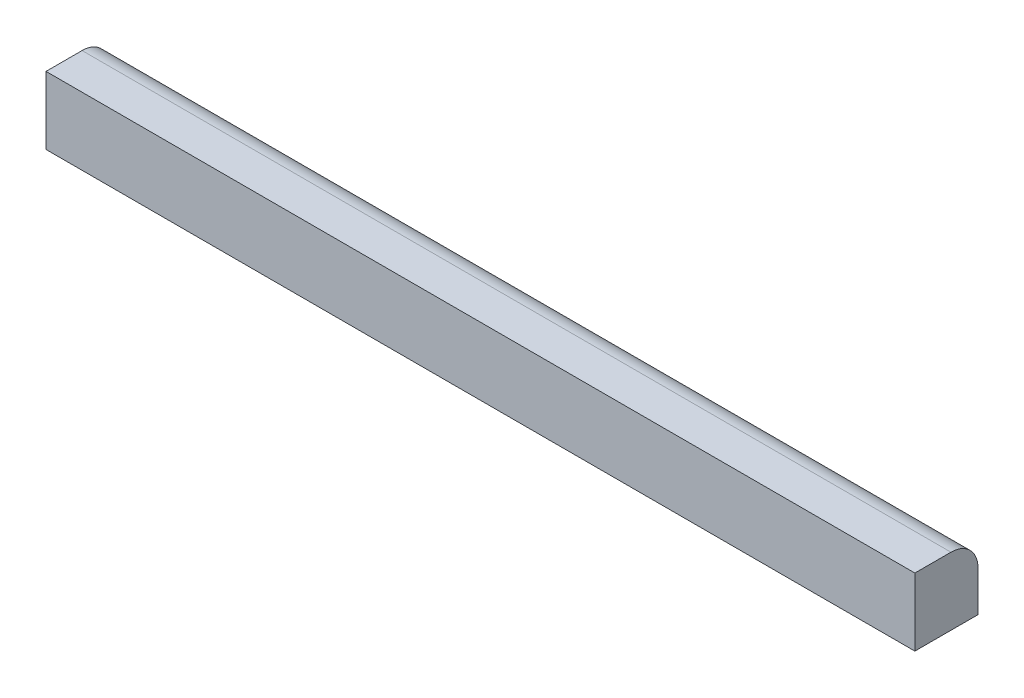
ISO-10303-21;
HEADER;
FILE_DESCRIPTION(('STEP AP214'),'2;1');
FILE_NAME('part.step','',(''),(''),'','','');
FILE_SCHEMA(('AUTOMOTIVE_DESIGN { 1 0 10303 214 1 1 1 1 }'));
ENDSEC;
DATA;
#1=APPLICATION_CONTEXT('core data for automotive mechanical design processes');
#2=APPLICATION_PROTOCOL_DEFINITION('international standard','automotive_design',2000,#1);
#3=PRODUCT_CONTEXT('',#1,'mechanical');
#4=PRODUCT('Part','Part','',(#3));
#5=PRODUCT_RELATED_PRODUCT_CATEGORY('part','',(#4));
#6=PRODUCT_DEFINITION_FORMATION('','',#4);
#7=PRODUCT_DEFINITION_CONTEXT('part definition',#1,'design');
#8=PRODUCT_DEFINITION('design','',#6,#7);
#9=PRODUCT_DEFINITION_SHAPE('','',#8);
#10=(LENGTH_UNIT() NAMED_UNIT(*) SI_UNIT(.MILLI.,.METRE.));
#11=(NAMED_UNIT(*) PLANE_ANGLE_UNIT() SI_UNIT($,.RADIAN.));
#12=(NAMED_UNIT(*) SI_UNIT($,.STERADIAN.) SOLID_ANGLE_UNIT());
#13=UNCERTAINTY_MEASURE_WITH_UNIT(LENGTH_MEASURE(1.E-05),#10,'distance_accuracy_value','');
#14=(GEOMETRIC_REPRESENTATION_CONTEXT(3) GLOBAL_UNCERTAINTY_ASSIGNED_CONTEXT((#13)) GLOBAL_UNIT_ASSIGNED_CONTEXT((#10,
#11,#12)) REPRESENTATION_CONTEXT('',''));
#15=CARTESIAN_POINT('',(0.,0.,0.));
#16=DIRECTION('',(0.,0.,1.));
#17=DIRECTION('',(1.,0.,0.));
#18=AXIS2_PLACEMENT_3D('',#15,#16,#17);
#19=CARTESIAN_POINT('',(144.5,-11.25,21.));
#20=DIRECTION('',(-1.,0.,0.));
#21=DIRECTION('',(0.,0.,1.));
#22=AXIS2_PLACEMENT_3D('',#19,#20,#21);
#23=PLANE('',#22);
#24=DIRECTION('',(0.,1.,0.));
#25=VECTOR('',#24,1.);
#26=CARTESIAN_POINT('',(144.5,-11.25,0.));
#27=LINE('',#26,#25);
#28=CARTESIAN_POINT('',(144.5,-11.25,0.));
#29=VERTEX_POINT('',#28);
#30=CARTESIAN_POINT('',(144.5,2.25,0.));
#31=VERTEX_POINT('',#30);
#32=EDGE_CURVE('E118',#29,#31,#27,.T.);
#33=ORIENTED_EDGE('',*,*,#32,.T.);
#34=CARTESIAN_POINT('',(144.5,2.25,9.));
#35=DIRECTION('',(-1.,0.,0.));
#36=DIRECTION('',(0.,0.,1.));
#37=AXIS2_PLACEMENT_3D('',#34,#35,#36);
#38=CIRCLE('',#37,9.);
#39=CARTESIAN_POINT('',(144.5,11.25,9.));
#40=VERTEX_POINT('',#39);
#41=EDGE_CURVE('E11',#31,#40,#38,.F.);
#42=ORIENTED_EDGE('',*,*,#41,.T.);
#43=DIRECTION('',(0.,0.,-1.));
#44=VECTOR('',#43,1.);
#45=CARTESIAN_POINT('',(144.5,11.25,21.));
#46=LINE('',#45,#44);
#47=CARTESIAN_POINT('',(144.5,11.25,21.));
#48=VERTEX_POINT('',#47);
#49=EDGE_CURVE('E86',#48,#40,#46,.T.);
#50=ORIENTED_EDGE('',*,*,#49,.F.);
#51=DIRECTION('',(0.,1.,0.));
#52=VECTOR('',#51,1.);
#53=CARTESIAN_POINT('',(144.5,-11.25,21.));
#54=LINE('',#53,#52);
#55=CARTESIAN_POINT('',(144.5,-11.25,21.));
#56=VERTEX_POINT('',#55);
#57=EDGE_CURVE('E92',#56,#48,#54,.T.);
#58=ORIENTED_EDGE('',*,*,#57,.F.);
#59=DIRECTION('',(0.,0.,-1.));
#60=VECTOR('',#59,1.);
#61=CARTESIAN_POINT('',(144.5,-11.25,21.));
#62=LINE('',#61,#60);
#63=EDGE_CURVE('E113',#56,#29,#62,.T.);
#64=ORIENTED_EDGE('',*,*,#63,.T.);
#65=EDGE_LOOP('',(#33,#42,#50,#58,#64));
#66=FACE_BOUND('',#65,.T.);
#67=ADVANCED_FACE('F35',(#66),#23,.F.);
#68=CARTESIAN_POINT('',(-144.5,11.25,21.));
#69=DIRECTION('',(0.,-1.,0.));
#70=DIRECTION('',(0.,0.,-1.));
#71=AXIS2_PLACEMENT_3D('',#68,#69,#70);
#72=PLANE('',#71);
#73=ORIENTED_EDGE('',*,*,#49,.T.);
#74=DIRECTION('',(-1.,0.,0.));
#75=VECTOR('',#74,1.);
#76=CARTESIAN_POINT('',(-144.5,11.25,9.));
#77=LINE('',#76,#75);
#78=CARTESIAN_POINT('',(-144.5,11.25,9.));
#79=VERTEX_POINT('',#78);
#80=EDGE_CURVE('E104',#40,#79,#77,.T.);
#81=ORIENTED_EDGE('',*,*,#80,.T.);
#82=DIRECTION('',(0.,0.,-1.));
#83=VECTOR('',#82,1.);
#84=CARTESIAN_POINT('',(-144.5,11.25,21.));
#85=LINE('',#84,#83);
#86=CARTESIAN_POINT('',(-144.5,11.25,21.));
#87=VERTEX_POINT('',#86);
#88=EDGE_CURVE('E88',#87,#79,#85,.T.);
#89=ORIENTED_EDGE('',*,*,#88,.F.);
#90=DIRECTION('',(-1.,0.,0.));
#91=VECTOR('',#90,1.);
#92=CARTESIAN_POINT('',(-144.5,11.25,21.));
#93=LINE('',#92,#91);
#94=EDGE_CURVE('E81',#48,#87,#93,.T.);
#95=ORIENTED_EDGE('',*,*,#94,.F.);
#96=EDGE_LOOP('',(#73,#81,#89,#95));
#97=FACE_BOUND('',#96,.T.);
#98=ADVANCED_FACE('F83',(#97),#72,.F.);
#99=CARTESIAN_POINT('',(-144.5,-11.25,21.));
#100=DIRECTION('',(1.,0.,0.));
#101=DIRECTION('',(0.,0.,-1.));
#102=AXIS2_PLACEMENT_3D('',#99,#100,#101);
#103=PLANE('',#102);
#104=ORIENTED_EDGE('',*,*,#88,.T.);
#105=CARTESIAN_POINT('',(-144.5,2.25,9.));
#106=DIRECTION('',(1.,0.,0.));
#107=DIRECTION('',(0.,0.,-1.));
#108=AXIS2_PLACEMENT_3D('',#105,#106,#107);
#109=CIRCLE('',#108,9.);
#110=CARTESIAN_POINT('',(-144.5,2.25,0.));
#111=VERTEX_POINT('',#110);
#112=EDGE_CURVE('E57',#79,#111,#109,.F.);
#113=ORIENTED_EDGE('',*,*,#112,.T.);
#114=DIRECTION('',(0.,-1.,0.));
#115=VECTOR('',#114,1.);
#116=CARTESIAN_POINT('',(-144.5,-11.25,0.));
#117=LINE('',#116,#115);
#118=CARTESIAN_POINT('',(-144.5,-11.25,0.));
#119=VERTEX_POINT('',#118);
#120=EDGE_CURVE('E116',#111,#119,#117,.T.);
#121=ORIENTED_EDGE('',*,*,#120,.T.);
#122=DIRECTION('',(0.,0.,-1.));
#123=VECTOR('',#122,1.);
#124=CARTESIAN_POINT('',(-144.5,-11.25,21.));
#125=LINE('',#124,#123);
#126=CARTESIAN_POINT('',(-144.5,-11.25,21.));
#127=VERTEX_POINT('',#126);
#128=EDGE_CURVE('E107',#127,#119,#125,.T.);
#129=ORIENTED_EDGE('',*,*,#128,.F.);
#130=DIRECTION('',(0.,-1.,0.));
#131=VECTOR('',#130,1.);
#132=CARTESIAN_POINT('',(-144.5,-11.25,21.));
#133=LINE('',#132,#131);
#134=EDGE_CURVE('E91',#87,#127,#133,.T.);
#135=ORIENTED_EDGE('',*,*,#134,.F.);
#136=EDGE_LOOP('',(#104,#113,#121,#129,#135));
#137=FACE_BOUND('',#136,.T.);
#138=ADVANCED_FACE('F122',(#137),#103,.F.);
#139=CARTESIAN_POINT('',(-144.5,-11.25,21.));
#140=DIRECTION('',(0.,1.,0.));
#141=DIRECTION('',(0.,0.,1.));
#142=AXIS2_PLACEMENT_3D('',#139,#140,#141);
#143=PLANE('',#142);
#144=DIRECTION('',(1.,0.,0.));
#145=VECTOR('',#144,1.);
#146=CARTESIAN_POINT('',(-144.5,-11.25,0.));
#147=LINE('',#146,#145);
#148=EDGE_CURVE('E101',#119,#29,#147,.T.);
#149=ORIENTED_EDGE('',*,*,#148,.T.);
#150=ORIENTED_EDGE('',*,*,#63,.F.);
#151=DIRECTION('',(1.,0.,0.));
#152=VECTOR('',#151,1.);
#153=CARTESIAN_POINT('',(-144.5,-11.25,21.));
#154=LINE('',#153,#152);
#155=EDGE_CURVE('E97',#127,#56,#154,.T.);
#156=ORIENTED_EDGE('',*,*,#155,.F.);
#157=ORIENTED_EDGE('',*,*,#128,.T.);
#158=EDGE_LOOP('',(#149,#150,#156,#157));
#159=FACE_BOUND('',#158,.T.);
#160=ADVANCED_FACE('F125',(#159),#143,.F.);
#161=CARTESIAN_POINT('',(0.,0.,21.));
#162=DIRECTION('',(0.,0.,-1.));
#163=DIRECTION('',(-1.,0.,0.));
#164=AXIS2_PLACEMENT_3D('',#161,#162,#163);
#165=PLANE('',#164);
#166=ORIENTED_EDGE('',*,*,#57,.T.);
#167=ORIENTED_EDGE('',*,*,#94,.T.);
#168=ORIENTED_EDGE('',*,*,#134,.T.);
#169=ORIENTED_EDGE('',*,*,#155,.T.);
#170=EDGE_LOOP('',(#166,#167,#168,#169));
#171=FACE_BOUND('',#170,.T.);
#172=ADVANCED_FACE('F95',(#171),#165,.F.);
#173=CARTESIAN_POINT('',(0.,0.,0.));
#174=DIRECTION('',(0.,0.,-1.));
#175=DIRECTION('',(-1.,0.,0.));
#176=AXIS2_PLACEMENT_3D('',#173,#174,#175);
#177=PLANE('',#176);
#178=ORIENTED_EDGE('',*,*,#120,.F.);
#179=DIRECTION('',(-1.,0.,0.));
#180=VECTOR('',#179,1.);
#181=CARTESIAN_POINT('',(144.5,2.25,0.));
#182=LINE('',#181,#180);
#183=EDGE_CURVE('E43',#111,#31,#182,.F.);
#184=ORIENTED_EDGE('',*,*,#183,.T.);
#185=ORIENTED_EDGE('',*,*,#32,.F.);
#186=ORIENTED_EDGE('',*,*,#148,.F.);
#187=EDGE_LOOP('',(#178,#184,#185,#186));
#188=FACE_BOUND('',#187,.T.);
#189=ADVANCED_FACE('F126',(#188),#177,.T.);
#190=CARTESIAN_POINT('',(-144.5,2.25,9.));
#191=DIRECTION('',(1.,0.,0.));
#192=DIRECTION('',(0.,0.,-1.));
#193=AXIS2_PLACEMENT_3D('',#190,#191,#192);
#194=CYLINDRICAL_SURFACE('',#193,9.);
#195=ORIENTED_EDGE('',*,*,#41,.F.);
#196=ORIENTED_EDGE('',*,*,#183,.F.);
#197=ORIENTED_EDGE('',*,*,#112,.F.);
#198=ORIENTED_EDGE('',*,*,#80,.F.);
#199=EDGE_LOOP('',(#195,#196,#197,#198));
#200=FACE_BOUND('',#199,.T.);
#201=ADVANCED_FACE('F37',(#200),#194,.T.);
#202=CLOSED_SHELL('',(#67,#98,#138,#160,#172,#189,#201));
#203=MANIFOLD_SOLID_BREP('B2',#202);
#204=ADVANCED_BREP_SHAPE_REPRESENTATION('',(#18,#203),#14);
#205=SHAPE_DEFINITION_REPRESENTATION(#9,#204);
ENDSEC;
END-ISO-10303-21;
